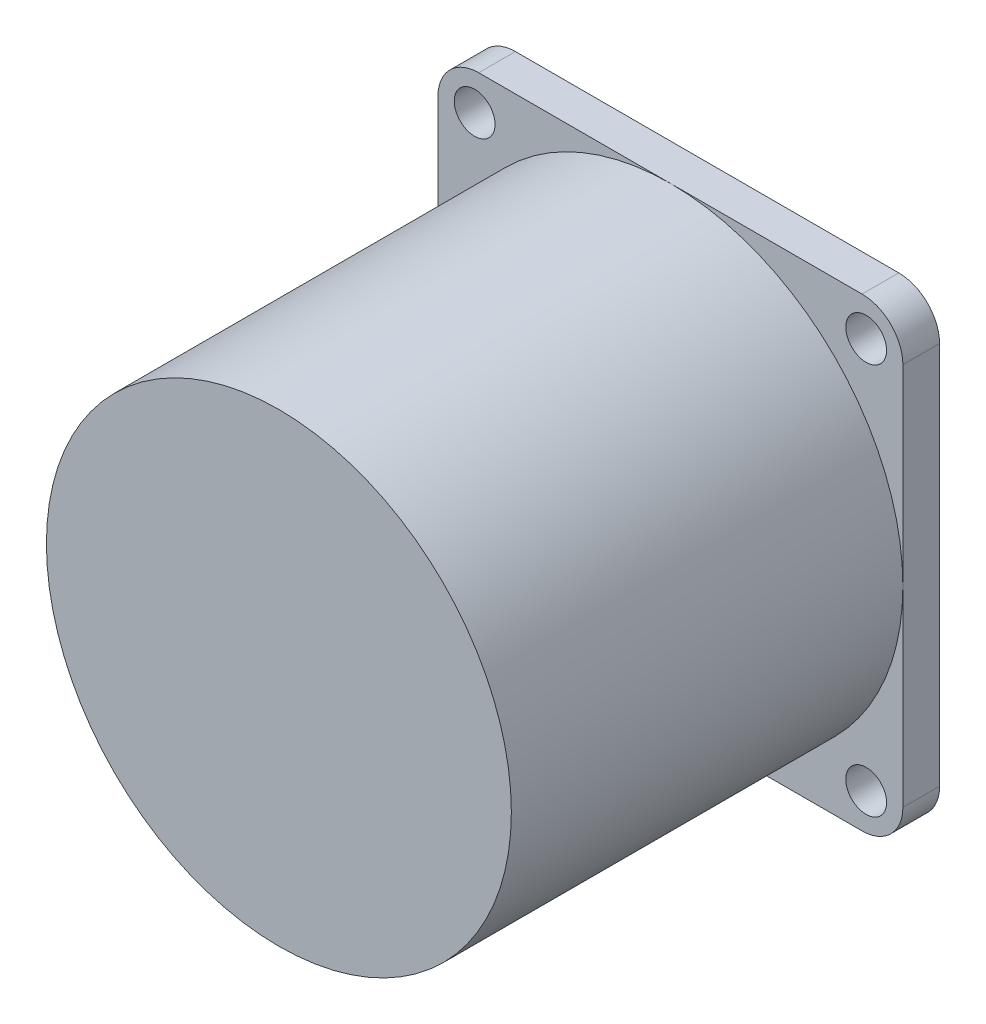
ISO-10303-21;
HEADER;
FILE_DESCRIPTION(('STEP AP214'),'2;1');
FILE_NAME('part.step','',(''),(''),'','','');
FILE_SCHEMA(('AUTOMOTIVE_DESIGN { 1 0 10303 214 1 1 1 1 }'));
ENDSEC;
DATA;
#1=APPLICATION_CONTEXT('core data for automotive mechanical design processes');
#2=APPLICATION_PROTOCOL_DEFINITION('international standard','automotive_design',2000,#1);
#3=PRODUCT_CONTEXT('',#1,'mechanical');
#4=PRODUCT('Part','Part','',(#3));
#5=PRODUCT_RELATED_PRODUCT_CATEGORY('part','',(#4));
#6=PRODUCT_DEFINITION_FORMATION('','',#4);
#7=PRODUCT_DEFINITION_CONTEXT('part definition',#1,'design');
#8=PRODUCT_DEFINITION('design','',#6,#7);
#9=PRODUCT_DEFINITION_SHAPE('','',#8);
#10=(LENGTH_UNIT() NAMED_UNIT(*) SI_UNIT(.MILLI.,.METRE.));
#11=(NAMED_UNIT(*) PLANE_ANGLE_UNIT() SI_UNIT($,.RADIAN.));
#12=(NAMED_UNIT(*) SI_UNIT($,.STERADIAN.) SOLID_ANGLE_UNIT());
#13=UNCERTAINTY_MEASURE_WITH_UNIT(LENGTH_MEASURE(1.E-05),#10,'distance_accuracy_value','');
#14=(GEOMETRIC_REPRESENTATION_CONTEXT(3) GLOBAL_UNCERTAINTY_ASSIGNED_CONTEXT((#13)) GLOBAL_UNIT_ASSIGNED_CONTEXT((#10,
#11,#12)) REPRESENTATION_CONTEXT('',''));
#15=CARTESIAN_POINT('',(0.,0.,0.));
#16=DIRECTION('',(0.,0.,1.));
#17=DIRECTION('',(1.,0.,0.));
#18=AXIS2_PLACEMENT_3D('',#15,#16,#17);
#19=CARTESIAN_POINT('',(-1.79855863382139,-6.79159049360147,-2.5));
#20=DIRECTION('',(0.,0.,-1.));
#21=DIRECTION('',(-1.,0.,0.));
#22=AXIS2_PLACEMENT_3D('',#19,#20,#21);
#23=PLANE('',#22);
#24=CARTESIAN_POINT('',(-1.79855863382139,-6.79159049360147,-2.5));
#25=DIRECTION('',(0.,0.,-1.));
#26=DIRECTION('',(-1.,0.,0.));
#27=AXIS2_PLACEMENT_3D('',#24,#25,#26);
#28=CIRCLE('',#27,6.75);
#29=CARTESIAN_POINT('',(-8.54855863382139,-6.79159049360147,-2.5));
#30=VERTEX_POINT('',#29);
#31=EDGE_CURVE('E144',#30,#30,#28,.T.);
#32=ORIENTED_EDGE('',*,*,#31,.T.);
#33=EDGE_LOOP('',(#32));
#34=FACE_BOUND('',#33,.T.);
#35=CARTESIAN_POINT('',(-1.79855863382139,-6.79159049360147,-2.5));
#36=DIRECTION('',(0.,0.,-1.));
#37=DIRECTION('',(-1.,0.,0.));
#38=AXIS2_PLACEMENT_3D('',#35,#36,#37);
#39=CIRCLE('',#38,3.);
#40=CARTESIAN_POINT('',(-4.79855863382139,-6.79159049360147,-2.5));
#41=VERTEX_POINT('',#40);
#42=EDGE_CURVE('E351',#41,#41,#39,.T.);
#43=ORIENTED_EDGE('',*,*,#42,.F.);
#44=EDGE_LOOP('',(#43));
#45=FACE_BOUND('',#44,.T.);
#46=ADVANCED_FACE('F34',(#34,#45),#23,.T.);
#47=CARTESIAN_POINT('',(-1.79855863382139,-6.79159049360147,-1.));
#48=DIRECTION('',(0.,0.,-1.));
#49=DIRECTION('',(-1.,0.,0.));
#50=AXIS2_PLACEMENT_3D('',#47,#48,#49);
#51=PLANE('',#50);
#52=CARTESIAN_POINT('',(-1.79855863382139,-6.79159049360147,-1.));
#53=DIRECTION('',(0.,0.,-1.));
#54=DIRECTION('',(-1.,0.,0.));
#55=AXIS2_PLACEMENT_3D('',#52,#53,#54);
#56=CIRCLE('',#55,18.);
#57=CARTESIAN_POINT('',(-19.7985586338214,-6.79159049360147,-1.));
#58=VERTEX_POINT('',#57);
#59=EDGE_CURVE('E38',#58,#58,#56,.T.);
#60=ORIENTED_EDGE('',*,*,#59,.T.);
#61=EDGE_LOOP('',(#60));
#62=FACE_BOUND('',#61,.T.);
#63=CARTESIAN_POINT('',(-1.79855863382139,-6.79159049360147,-1.));
#64=DIRECTION('',(0.,0.,-1.));
#65=DIRECTION('',(-1.,0.,0.));
#66=AXIS2_PLACEMENT_3D('',#63,#64,#65);
#67=CIRCLE('',#66,6.75);
#68=CARTESIAN_POINT('',(-8.54855863382139,-6.79159049360147,-1.));
#69=VERTEX_POINT('',#68);
#70=EDGE_CURVE('E350',#69,#69,#67,.T.);
#71=ORIENTED_EDGE('',*,*,#70,.F.);
#72=EDGE_LOOP('',(#71));
#73=FACE_BOUND('',#72,.T.);
#74=ADVANCED_FACE('F247',(#62,#73),#51,.T.);
#75=CARTESIAN_POINT('',(-30.2985586338214,-35.2915904936015,4.5));
#76=DIRECTION('',(0.,0.,1.));
#77=DIRECTION('',(1.,0.,0.));
#78=AXIS2_PLACEMENT_3D('',#75,#76,#77);
#79=PLANE('',#78);
#80=CARTESIAN_POINT('',(-1.79855863382139,-6.79159049360147,4.5));
#81=DIRECTION('',(0.,0.,1.));
#82=DIRECTION('',(1.,0.,0.));
#83=AXIS2_PLACEMENT_3D('',#80,#81,#82);
#84=CIRCLE('',#83,28.5);
#85=CARTESIAN_POINT('',(26.7014413661786,-6.79159049360147,4.5));
#86=VERTEX_POINT('',#85);
#87=CARTESIAN_POINT('',(-1.79855863382139,21.7084095063985,4.5));
#88=VERTEX_POINT('',#87);
#89=EDGE_CURVE('E45',#86,#88,#84,.T.);
#90=ORIENTED_EDGE('',*,*,#89,.F.);
#91=DIRECTION('',(0.,1.,0.));
#92=VECTOR('',#91,1.);
#93=CARTESIAN_POINT('',(26.7014413661786,21.7084095063985,4.5));
#94=LINE('',#93,#92);
#95=CARTESIAN_POINT('',(26.7014413661786,16.7084095063985,4.5));
#96=VERTEX_POINT('',#95);
#97=EDGE_CURVE('E125',#86,#96,#94,.T.);
#98=ORIENTED_EDGE('',*,*,#97,.T.);
#99=CARTESIAN_POINT('',(21.7014413661786,16.7084095063985,4.5));
#100=DIRECTION('',(0.,0.,1.));
#101=DIRECTION('',(1.,0.,0.));
#102=AXIS2_PLACEMENT_3D('',#99,#100,#101);
#103=CIRCLE('',#102,5.);
#104=CARTESIAN_POINT('',(21.7014413661786,21.7084095063985,4.5));
#105=VERTEX_POINT('',#104);
#106=EDGE_CURVE('E209',#96,#105,#103,.T.);
#107=ORIENTED_EDGE('',*,*,#106,.T.);
#108=DIRECTION('',(-1.,0.,0.));
#109=VECTOR('',#108,1.);
#110=CARTESIAN_POINT('',(-30.2985586338214,21.7084095063985,4.5));
#111=LINE('',#110,#109);
#112=EDGE_CURVE('E141',#105,#88,#111,.T.);
#113=ORIENTED_EDGE('',*,*,#112,.T.);
#114=EDGE_LOOP('',(#90,#98,#107,#113));
#115=FACE_BOUND('',#114,.T.);
#116=CARTESIAN_POINT('',(22.2014413661786,17.2084095063985,4.5));
#117=DIRECTION('',(0.,0.,1.));
#118=DIRECTION('',(1.,0.,0.));
#119=AXIS2_PLACEMENT_3D('',#116,#117,#118);
#120=CIRCLE('',#119,2.5);
#121=CARTESIAN_POINT('',(24.7014413661786,17.2084095063985,4.5));
#122=VERTEX_POINT('',#121);
#123=EDGE_CURVE('E164',#122,#122,#120,.T.);
#124=ORIENTED_EDGE('',*,*,#123,.F.);
#125=EDGE_LOOP('',(#124));
#126=FACE_BOUND('',#125,.T.);
#127=ADVANCED_FACE('F138',(#115,#126),#79,.T.);
#128=CARTESIAN_POINT('',(-30.2985586338214,-6.79159049360147,4.5));
#129=VERTEX_POINT('',#128);
#130=EDGE_CURVE('E11',#88,#129,#84,.T.);
#131=ORIENTED_EDGE('',*,*,#130,.F.);
#132=CARTESIAN_POINT('',(-25.2985586338214,21.7084095063985,4.5));
#133=VERTEX_POINT('',#132);
#134=EDGE_CURVE('E124',#88,#133,#111,.T.);
#135=ORIENTED_EDGE('',*,*,#134,.T.);
#136=CARTESIAN_POINT('',(-25.2985586338214,16.7084095063985,4.5));
#137=DIRECTION('',(0.,0.,1.));
#138=DIRECTION('',(1.,0.,0.));
#139=AXIS2_PLACEMENT_3D('',#136,#137,#138);
#140=CIRCLE('',#139,5.);
#141=CARTESIAN_POINT('',(-30.2985586338214,16.7084095063985,4.5));
#142=VERTEX_POINT('',#141);
#143=EDGE_CURVE('E213',#133,#142,#140,.T.);
#144=ORIENTED_EDGE('',*,*,#143,.T.);
#145=DIRECTION('',(0.,-1.,0.));
#146=VECTOR('',#145,1.);
#147=CARTESIAN_POINT('',(-30.2985586338214,21.7084095063985,4.5));
#148=LINE('',#147,#146);
#149=EDGE_CURVE('E176',#142,#129,#148,.T.);
#150=ORIENTED_EDGE('',*,*,#149,.T.);
#151=EDGE_LOOP('',(#131,#135,#144,#150));
#152=FACE_BOUND('',#151,.T.);
#153=CARTESIAN_POINT('',(-25.7985586338214,17.2084095063985,4.5));
#154=DIRECTION('',(0.,0.,1.));
#155=DIRECTION('',(1.,0.,0.));
#156=AXIS2_PLACEMENT_3D('',#153,#154,#155);
#157=CIRCLE('',#156,2.5);
#158=CARTESIAN_POINT('',(-23.2985586338214,17.2084095063985,4.5));
#159=VERTEX_POINT('',#158);
#160=EDGE_CURVE('E170',#159,#159,#157,.T.);
#161=ORIENTED_EDGE('',*,*,#160,.F.);
#162=EDGE_LOOP('',(#161));
#163=FACE_BOUND('',#162,.T.);
#164=ADVANCED_FACE('F243',(#152,#163),#79,.T.);
#165=CARTESIAN_POINT('',(-1.79855863382139,-35.2915904936015,4.5));
#166=VERTEX_POINT('',#165);
#167=EDGE_CURVE('E43',#129,#166,#84,.T.);
#168=ORIENTED_EDGE('',*,*,#167,.F.);
#169=CARTESIAN_POINT('',(-30.2985586338214,-30.2915904936015,4.5));
#170=VERTEX_POINT('',#169);
#171=EDGE_CURVE('E179',#129,#170,#148,.T.);
#172=ORIENTED_EDGE('',*,*,#171,.T.);
#173=CARTESIAN_POINT('',(-25.2985586338214,-30.2915904936015,4.5));
#174=DIRECTION('',(0.,0.,1.));
#175=DIRECTION('',(1.,0.,0.));
#176=AXIS2_PLACEMENT_3D('',#173,#174,#175);
#177=CIRCLE('',#176,5.);
#178=CARTESIAN_POINT('',(-25.2985586338214,-35.2915904936015,4.5));
#179=VERTEX_POINT('',#178);
#180=EDGE_CURVE('E211',#170,#179,#177,.T.);
#181=ORIENTED_EDGE('',*,*,#180,.T.);
#182=DIRECTION('',(1.,0.,0.));
#183=VECTOR('',#182,1.);
#184=CARTESIAN_POINT('',(-30.2985586338214,-35.2915904936015,4.5));
#185=LINE('',#184,#183);
#186=EDGE_CURVE('E135',#179,#166,#185,.T.);
#187=ORIENTED_EDGE('',*,*,#186,.T.);
#188=EDGE_LOOP('',(#168,#172,#181,#187));
#189=FACE_BOUND('',#188,.T.);
#190=CARTESIAN_POINT('',(-25.7985586338214,-30.7915904936015,4.5));
#191=DIRECTION('',(0.,0.,1.));
#192=DIRECTION('',(1.,0.,0.));
#193=AXIS2_PLACEMENT_3D('',#190,#191,#192);
#194=CIRCLE('',#193,2.5);
#195=CARTESIAN_POINT('',(-23.2985586338214,-30.7915904936015,4.5));
#196=VERTEX_POINT('',#195);
#197=EDGE_CURVE('E151',#196,#196,#194,.T.);
#198=ORIENTED_EDGE('',*,*,#197,.F.);
#199=EDGE_LOOP('',(#198));
#200=FACE_BOUND('',#199,.T.);
#201=ADVANCED_FACE('F234',(#189,#200),#79,.T.);
#202=CARTESIAN_POINT('',(-30.2985586338214,-35.2915904936015,0.));
#203=DIRECTION('',(0.,0.,1.));
#204=DIRECTION('',(1.,0.,0.));
#205=AXIS2_PLACEMENT_3D('',#202,#203,#204);
#206=PLANE('',#205);
#207=CARTESIAN_POINT('',(-25.7985586338214,-30.7915904936015,0.));
#208=DIRECTION('',(0.,0.,1.));
#209=DIRECTION('',(1.,0.,0.));
#210=AXIS2_PLACEMENT_3D('',#207,#208,#209);
#211=CIRCLE('',#210,2.5);
#212=CARTESIAN_POINT('',(-23.2985586338214,-30.7915904936015,0.));
#213=VERTEX_POINT('',#212);
#214=EDGE_CURVE('E155',#213,#213,#211,.T.);
#215=ORIENTED_EDGE('',*,*,#214,.T.);
#216=EDGE_LOOP('',(#215));
#217=FACE_BOUND('',#216,.T.);
#218=CARTESIAN_POINT('',(22.2014413661786,17.2084095063985,0.));
#219=DIRECTION('',(0.,0.,1.));
#220=DIRECTION('',(1.,0.,0.));
#221=AXIS2_PLACEMENT_3D('',#218,#219,#220);
#222=CIRCLE('',#221,2.5);
#223=CARTESIAN_POINT('',(24.7014413661786,17.2084095063985,0.));
#224=VERTEX_POINT('',#223);
#225=EDGE_CURVE('E161',#224,#224,#222,.T.);
#226=ORIENTED_EDGE('',*,*,#225,.T.);
#227=EDGE_LOOP('',(#226));
#228=FACE_BOUND('',#227,.T.);
#229=DIRECTION('',(0.,1.,0.));
#230=VECTOR('',#229,1.);
#231=CARTESIAN_POINT('',(26.7014413661786,21.7084095063985,0.));
#232=LINE('',#231,#230);
#233=CARTESIAN_POINT('',(26.7014413661786,-30.2915904936015,0.));
#234=VERTEX_POINT('',#233);
#235=CARTESIAN_POINT('',(26.7014413661786,16.7084095063985,0.));
#236=VERTEX_POINT('',#235);
#237=EDGE_CURVE('E187',#234,#236,#232,.T.);
#238=ORIENTED_EDGE('',*,*,#237,.F.);
#239=CARTESIAN_POINT('',(21.7014413661786,-30.2915904936015,0.));
#240=DIRECTION('',(0.,0.,1.));
#241=DIRECTION('',(1.,0.,0.));
#242=AXIS2_PLACEMENT_3D('',#239,#240,#241);
#243=CIRCLE('',#242,5.);
#244=CARTESIAN_POINT('',(21.7014413661786,-35.2915904936015,0.));
#245=VERTEX_POINT('',#244);
#246=EDGE_CURVE('E201',#234,#245,#243,.F.);
#247=ORIENTED_EDGE('',*,*,#246,.T.);
#248=DIRECTION('',(1.,0.,0.));
#249=VECTOR('',#248,1.);
#250=CARTESIAN_POINT('',(-30.2985586338214,-35.2915904936015,0.));
#251=LINE('',#250,#249);
#252=CARTESIAN_POINT('',(-25.2985586338214,-35.2915904936015,0.));
#253=VERTEX_POINT('',#252);
#254=EDGE_CURVE('E184',#253,#245,#251,.T.);
#255=ORIENTED_EDGE('',*,*,#254,.F.);
#256=CARTESIAN_POINT('',(-25.2985586338214,-30.2915904936015,0.));
#257=DIRECTION('',(0.,0.,1.));
#258=DIRECTION('',(1.,0.,0.));
#259=AXIS2_PLACEMENT_3D('',#256,#257,#258);
#260=CIRCLE('',#259,5.);
#261=CARTESIAN_POINT('',(-30.2985586338214,-30.2915904936015,0.));
#262=VERTEX_POINT('',#261);
#263=EDGE_CURVE('E197',#253,#262,#260,.F.);
#264=ORIENTED_EDGE('',*,*,#263,.T.);
#265=DIRECTION('',(0.,-1.,0.));
#266=VECTOR('',#265,1.);
#267=CARTESIAN_POINT('',(-30.2985586338214,21.7084095063985,0.));
#268=LINE('',#267,#266);
#269=CARTESIAN_POINT('',(-30.2985586338214,16.7084095063985,0.));
#270=VERTEX_POINT('',#269);
#271=EDGE_CURVE('E173',#270,#262,#268,.T.);
#272=ORIENTED_EDGE('',*,*,#271,.F.);
#273=CARTESIAN_POINT('',(-25.2985586338214,16.7084095063985,0.));
#274=DIRECTION('',(0.,0.,1.));
#275=DIRECTION('',(1.,0.,0.));
#276=AXIS2_PLACEMENT_3D('',#273,#274,#275);
#277=CIRCLE('',#276,5.);
#278=CARTESIAN_POINT('',(-25.2985586338214,21.7084095063985,0.));
#279=VERTEX_POINT('',#278);
#280=EDGE_CURVE('E199',#270,#279,#277,.F.);
#281=ORIENTED_EDGE('',*,*,#280,.T.);
#282=DIRECTION('',(-1.,0.,0.));
#283=VECTOR('',#282,1.);
#284=CARTESIAN_POINT('',(-30.2985586338214,21.7084095063985,0.));
#285=LINE('',#284,#283);
#286=CARTESIAN_POINT('',(21.7014413661786,21.7084095063985,0.));
#287=VERTEX_POINT('',#286);
#288=EDGE_CURVE('E189',#287,#279,#285,.T.);
#289=ORIENTED_EDGE('',*,*,#288,.F.);
#290=CARTESIAN_POINT('',(21.7014413661786,16.7084095063985,0.));
#291=DIRECTION('',(0.,0.,1.));
#292=DIRECTION('',(1.,0.,0.));
#293=AXIS2_PLACEMENT_3D('',#290,#291,#292);
#294=CIRCLE('',#293,5.);
#295=EDGE_CURVE('E195',#287,#236,#294,.F.);
#296=ORIENTED_EDGE('',*,*,#295,.T.);
#297=EDGE_LOOP('',(#238,#247,#255,#264,#272,#281,#289,#296));
#298=FACE_BOUND('',#297,.T.);
#299=CARTESIAN_POINT('',(-25.7985586338214,17.2084095063985,0.));
#300=DIRECTION('',(0.,0.,1.));
#301=DIRECTION('',(1.,0.,0.));
#302=AXIS2_PLACEMENT_3D('',#299,#300,#301);
#303=CIRCLE('',#302,2.5);
#304=CARTESIAN_POINT('',(-23.2985586338214,17.2084095063985,0.));
#305=VERTEX_POINT('',#304);
#306=EDGE_CURVE('E167',#305,#305,#303,.T.);
#307=ORIENTED_EDGE('',*,*,#306,.T.);
#308=EDGE_LOOP('',(#307));
#309=FACE_BOUND('',#308,.T.);
#310=CARTESIAN_POINT('',(22.2014413661786,-30.7915904936015,0.));
#311=DIRECTION('',(0.,0.,1.));
#312=DIRECTION('',(1.,0.,0.));
#313=AXIS2_PLACEMENT_3D('',#310,#311,#312);
#314=CIRCLE('',#313,2.5);
#315=CARTESIAN_POINT('',(24.7014413661786,-30.7915904936015,0.));
#316=VERTEX_POINT('',#315);
#317=EDGE_CURVE('E154',#316,#316,#314,.T.);
#318=ORIENTED_EDGE('',*,*,#317,.T.);
#319=EDGE_LOOP('',(#318));
#320=FACE_BOUND('',#319,.T.);
#321=CARTESIAN_POINT('',(-1.79855863382139,-6.79159049360147,0.));
#322=DIRECTION('',(0.,0.,1.));
#323=DIRECTION('',(1.,0.,0.));
#324=AXIS2_PLACEMENT_3D('',#321,#322,#323);
#325=CIRCLE('',#324,19.);
#326=CARTESIAN_POINT('',(17.2014413661786,-6.79159049360147,0.));
#327=VERTEX_POINT('',#326);
#328=EDGE_CURVE('E147',#327,#327,#325,.F.);
#329=ORIENTED_EDGE('',*,*,#328,.F.);
#330=EDGE_LOOP('',(#329));
#331=FACE_BOUND('',#330,.T.);
#332=ADVANCED_FACE('F232',(#217,#228,#298,#309,#320,#331),#206,.F.);
#333=EDGE_CURVE('E117',#166,#86,#84,.T.);
#334=ORIENTED_EDGE('',*,*,#333,.F.);
#335=CARTESIAN_POINT('',(21.7014413661786,-35.2915904936015,4.5));
#336=VERTEX_POINT('',#335);
#337=EDGE_CURVE('E178',#166,#336,#185,.T.);
#338=ORIENTED_EDGE('',*,*,#337,.T.);
#339=CARTESIAN_POINT('',(21.7014413661786,-30.2915904936015,4.5));
#340=DIRECTION('',(0.,0.,1.));
#341=DIRECTION('',(1.,0.,0.));
#342=AXIS2_PLACEMENT_3D('',#339,#340,#341);
#343=CIRCLE('',#342,5.);
#344=CARTESIAN_POINT('',(26.7014413661786,-30.2915904936015,4.5));
#345=VERTEX_POINT('',#344);
#346=EDGE_CURVE('E120',#336,#345,#343,.T.);
#347=ORIENTED_EDGE('',*,*,#346,.T.);
#348=EDGE_CURVE('E112',#345,#86,#94,.T.);
#349=ORIENTED_EDGE('',*,*,#348,.T.);
#350=EDGE_LOOP('',(#334,#338,#347,#349));
#351=FACE_BOUND('',#350,.T.);
#352=CARTESIAN_POINT('',(22.2014413661786,-30.7915904936015,4.5));
#353=DIRECTION('',(0.,0.,1.));
#354=DIRECTION('',(1.,0.,0.));
#355=AXIS2_PLACEMENT_3D('',#352,#353,#354);
#356=CIRCLE('',#355,2.5);
#357=CARTESIAN_POINT('',(24.7014413661786,-30.7915904936015,4.5));
#358=VERTEX_POINT('',#357);
#359=EDGE_CURVE('E158',#358,#358,#356,.T.);
#360=ORIENTED_EDGE('',*,*,#359,.F.);
#361=EDGE_LOOP('',(#360));
#362=FACE_BOUND('',#361,.T.);
#363=ADVANCED_FACE('F114',(#351,#362),#79,.T.);
#364=CARTESIAN_POINT('',(-30.2985586338214,21.7084095063985,4.5));
#365=DIRECTION('',(1.,0.,0.));
#366=DIRECTION('',(0.,0.,-1.));
#367=AXIS2_PLACEMENT_3D('',#364,#365,#366);
#368=PLANE('',#367);
#369=ORIENTED_EDGE('',*,*,#149,.F.);
#370=DIRECTION('',(0.,0.,-1.));
#371=VECTOR('',#370,1.);
#372=CARTESIAN_POINT('',(-30.2985586338214,16.7084095063985,4.5));
#373=LINE('',#372,#371);
#374=EDGE_CURVE('E219',#142,#270,#373,.T.);
#375=ORIENTED_EDGE('',*,*,#374,.T.);
#376=ORIENTED_EDGE('',*,*,#271,.T.);
#377=DIRECTION('',(0.,0.,-1.));
#378=VECTOR('',#377,1.);
#379=CARTESIAN_POINT('',(-30.2985586338214,-30.2915904936015,4.5));
#380=LINE('',#379,#378);
#381=EDGE_CURVE('E216',#262,#170,#380,.F.);
#382=ORIENTED_EDGE('',*,*,#381,.T.);
#383=ORIENTED_EDGE('',*,*,#171,.F.);
#384=EDGE_LOOP('',(#369,#375,#376,#382,#383));
#385=FACE_BOUND('',#384,.T.);
#386=ADVANCED_FACE('F241',(#385),#368,.F.);
#387=CARTESIAN_POINT('',(-30.2985586338214,-35.2915904936015,4.5));
#388=DIRECTION('',(0.,1.,0.));
#389=DIRECTION('',(0.,0.,1.));
#390=AXIS2_PLACEMENT_3D('',#387,#388,#389);
#391=PLANE('',#390);
#392=ORIENTED_EDGE('',*,*,#254,.T.);
#393=DIRECTION('',(0.,0.,-1.));
#394=VECTOR('',#393,1.);
#395=CARTESIAN_POINT('',(21.7014413661786,-35.2915904936015,4.5));
#396=LINE('',#395,#394);
#397=EDGE_CURVE('E206',#245,#336,#396,.F.);
#398=ORIENTED_EDGE('',*,*,#397,.T.);
#399=ORIENTED_EDGE('',*,*,#337,.F.);
#400=ORIENTED_EDGE('',*,*,#186,.F.);
#401=DIRECTION('',(0.,0.,-1.));
#402=VECTOR('',#401,1.);
#403=CARTESIAN_POINT('',(-25.2985586338214,-35.2915904936015,4.5));
#404=LINE('',#403,#402);
#405=EDGE_CURVE('E203',#179,#253,#404,.T.);
#406=ORIENTED_EDGE('',*,*,#405,.T.);
#407=EDGE_LOOP('',(#392,#398,#399,#400,#406));
#408=FACE_BOUND('',#407,.T.);
#409=ADVANCED_FACE('F430',(#408),#391,.F.);
#410=CARTESIAN_POINT('',(26.7014413661786,21.7084095063985,4.5));
#411=DIRECTION('',(-1.,0.,0.));
#412=DIRECTION('',(0.,-1.,0.));
#413=AXIS2_PLACEMENT_3D('',#410,#411,#412);
#414=PLANE('',#413);
#415=ORIENTED_EDGE('',*,*,#348,.F.);
#416=DIRECTION('',(0.,0.,-1.));
#417=VECTOR('',#416,1.);
#418=CARTESIAN_POINT('',(26.7014413661786,-30.2915904936015,4.5));
#419=LINE('',#418,#417);
#420=EDGE_CURVE('E193',#345,#234,#419,.T.);
#421=ORIENTED_EDGE('',*,*,#420,.T.);
#422=ORIENTED_EDGE('',*,*,#237,.T.);
#423=DIRECTION('',(0.,0.,-1.));
#424=VECTOR('',#423,1.);
#425=CARTESIAN_POINT('',(26.7014413661786,16.7084095063985,4.5));
#426=LINE('',#425,#424);
#427=EDGE_CURVE('E132',#236,#96,#426,.F.);
#428=ORIENTED_EDGE('',*,*,#427,.T.);
#429=ORIENTED_EDGE('',*,*,#97,.F.);
#430=EDGE_LOOP('',(#415,#421,#422,#428,#429));
#431=FACE_BOUND('',#430,.T.);
#432=ADVANCED_FACE('F129',(#431),#414,.F.);
#433=CARTESIAN_POINT('',(-30.2985586338214,21.7084095063985,4.5));
#434=DIRECTION('',(0.,-1.,0.));
#435=DIRECTION('',(0.,0.,-1.));
#436=AXIS2_PLACEMENT_3D('',#433,#434,#435);
#437=PLANE('',#436);
#438=ORIENTED_EDGE('',*,*,#288,.T.);
#439=DIRECTION('',(0.,0.,-1.));
#440=VECTOR('',#439,1.);
#441=CARTESIAN_POINT('',(-25.2985586338214,21.7084095063985,4.5));
#442=LINE('',#441,#440);
#443=EDGE_CURVE('E225',#279,#133,#442,.F.);
#444=ORIENTED_EDGE('',*,*,#443,.T.);
#445=ORIENTED_EDGE('',*,*,#134,.F.);
#446=ORIENTED_EDGE('',*,*,#112,.F.);
#447=DIRECTION('',(0.,0.,-1.));
#448=VECTOR('',#447,1.);
#449=CARTESIAN_POINT('',(21.7014413661786,21.7084095063985,4.5));
#450=LINE('',#449,#448);
#451=EDGE_CURVE('E222',#105,#287,#450,.T.);
#452=ORIENTED_EDGE('',*,*,#451,.T.);
#453=EDGE_LOOP('',(#438,#444,#445,#446,#452));
#454=FACE_BOUND('',#453,.T.);
#455=ADVANCED_FACE('F287',(#454),#437,.F.);
#456=CARTESIAN_POINT('',(-25.7985586338214,17.2084095063985,4.5));
#457=DIRECTION('',(0.,0.,-1.));
#458=DIRECTION('',(-1.,0.,0.));
#459=AXIS2_PLACEMENT_3D('',#456,#457,#458);
#460=CYLINDRICAL_SURFACE('',#459,2.5);
#461=ORIENTED_EDGE('',*,*,#160,.T.);
#462=EDGE_LOOP('',(#461));
#463=FACE_BOUND('',#462,.T.);
#464=ORIENTED_EDGE('',*,*,#306,.F.);
#465=EDGE_LOOP('',(#464));
#466=FACE_BOUND('',#465,.T.);
#467=ADVANCED_FACE('F284',(#463,#466),#460,.F.);
#468=CARTESIAN_POINT('',(22.2014413661786,17.2084095063985,4.5));
#469=DIRECTION('',(0.,0.,-1.));
#470=DIRECTION('',(-1.,0.,0.));
#471=AXIS2_PLACEMENT_3D('',#468,#469,#470);
#472=CYLINDRICAL_SURFACE('',#471,2.5);
#473=ORIENTED_EDGE('',*,*,#123,.T.);
#474=EDGE_LOOP('',(#473));
#475=FACE_BOUND('',#474,.T.);
#476=ORIENTED_EDGE('',*,*,#225,.F.);
#477=EDGE_LOOP('',(#476));
#478=FACE_BOUND('',#477,.T.);
#479=ADVANCED_FACE('F280',(#475,#478),#472,.F.);
#480=CARTESIAN_POINT('',(22.2014413661786,-30.7915904936015,4.5));
#481=DIRECTION('',(0.,0.,-1.));
#482=DIRECTION('',(-1.,0.,0.));
#483=AXIS2_PLACEMENT_3D('',#480,#481,#482);
#484=CYLINDRICAL_SURFACE('',#483,2.5);
#485=ORIENTED_EDGE('',*,*,#359,.T.);
#486=EDGE_LOOP('',(#485));
#487=FACE_BOUND('',#486,.T.);
#488=ORIENTED_EDGE('',*,*,#317,.F.);
#489=EDGE_LOOP('',(#488));
#490=FACE_BOUND('',#489,.T.);
#491=ADVANCED_FACE('F276',(#487,#490),#484,.F.);
#492=CARTESIAN_POINT('',(-25.7985586338214,-30.7915904936015,4.5));
#493=DIRECTION('',(0.,0.,-1.));
#494=DIRECTION('',(-1.,0.,0.));
#495=AXIS2_PLACEMENT_3D('',#492,#493,#494);
#496=CYLINDRICAL_SURFACE('',#495,2.5);
#497=ORIENTED_EDGE('',*,*,#197,.T.);
#498=EDGE_LOOP('',(#497));
#499=FACE_BOUND('',#498,.T.);
#500=ORIENTED_EDGE('',*,*,#214,.F.);
#501=EDGE_LOOP('',(#500));
#502=FACE_BOUND('',#501,.T.);
#503=ADVANCED_FACE('F272',(#499,#502),#496,.F.);
#504=CARTESIAN_POINT('',(21.7014413661786,-30.2915904936015,4.5));
#505=DIRECTION('',(0.,0.,-1.));
#506=DIRECTION('',(-1.,0.,0.));
#507=AXIS2_PLACEMENT_3D('',#504,#505,#506);
#508=CYLINDRICAL_SURFACE('',#507,5.);
#509=ORIENTED_EDGE('',*,*,#346,.F.);
#510=ORIENTED_EDGE('',*,*,#397,.F.);
#511=ORIENTED_EDGE('',*,*,#246,.F.);
#512=ORIENTED_EDGE('',*,*,#420,.F.);
#513=EDGE_LOOP('',(#509,#510,#511,#512));
#514=FACE_BOUND('',#513,.T.);
#515=ADVANCED_FACE('F275',(#514),#508,.T.);
#516=CARTESIAN_POINT('',(-25.2985586338214,16.7084095063985,4.5));
#517=DIRECTION('',(0.,0.,-1.));
#518=DIRECTION('',(-1.,0.,0.));
#519=AXIS2_PLACEMENT_3D('',#516,#517,#518);
#520=CYLINDRICAL_SURFACE('',#519,5.);
#521=ORIENTED_EDGE('',*,*,#143,.F.);
#522=ORIENTED_EDGE('',*,*,#443,.F.);
#523=ORIENTED_EDGE('',*,*,#280,.F.);
#524=ORIENTED_EDGE('',*,*,#374,.F.);
#525=EDGE_LOOP('',(#521,#522,#523,#524));
#526=FACE_BOUND('',#525,.T.);
#527=ADVANCED_FACE('F383',(#526),#520,.T.);
#528=CARTESIAN_POINT('',(-25.2985586338214,-30.2915904936015,4.5));
#529=DIRECTION('',(0.,0.,-1.));
#530=DIRECTION('',(-1.,0.,0.));
#531=AXIS2_PLACEMENT_3D('',#528,#529,#530);
#532=CYLINDRICAL_SURFACE('',#531,5.);
#533=ORIENTED_EDGE('',*,*,#180,.F.);
#534=ORIENTED_EDGE('',*,*,#381,.F.);
#535=ORIENTED_EDGE('',*,*,#263,.F.);
#536=ORIENTED_EDGE('',*,*,#405,.F.);
#537=EDGE_LOOP('',(#533,#534,#535,#536));
#538=FACE_BOUND('',#537,.T.);
#539=ADVANCED_FACE('F376',(#538),#532,.T.);
#540=CARTESIAN_POINT('',(21.7014413661786,16.7084095063985,4.5));
#541=DIRECTION('',(0.,0.,-1.));
#542=DIRECTION('',(-1.,0.,0.));
#543=AXIS2_PLACEMENT_3D('',#540,#541,#542);
#544=CYLINDRICAL_SURFACE('',#543,5.);
#545=ORIENTED_EDGE('',*,*,#106,.F.);
#546=ORIENTED_EDGE('',*,*,#427,.F.);
#547=ORIENTED_EDGE('',*,*,#295,.F.);
#548=ORIENTED_EDGE('',*,*,#451,.F.);
#549=EDGE_LOOP('',(#545,#546,#547,#548));
#550=FACE_BOUND('',#549,.T.);
#551=ADVANCED_FACE('F370',(#550),#544,.T.);
#552=CARTESIAN_POINT('',(-1.79855863382139,-6.79159049360147,-1.));
#553=DIRECTION('',(0.,0.,1.));
#554=DIRECTION('',(1.,0.,0.));
#555=AXIS2_PLACEMENT_3D('',#552,#553,#554);
#556=CONICAL_SURFACE('',#555,18.,0.785398163397445);
#557=ORIENTED_EDGE('',*,*,#328,.T.);
#558=EDGE_LOOP('',(#557));
#559=FACE_BOUND('',#558,.T.);
#560=ORIENTED_EDGE('',*,*,#59,.F.);
#561=EDGE_LOOP('',(#560));
#562=FACE_BOUND('',#561,.T.);
#563=ADVANCED_FACE('F36',(#559,#562),#556,.T.);
#564=CARTESIAN_POINT('',(-1.79855863382139,-6.79159049360147,52.5));
#565=DIRECTION('',(0.,0.,-1.));
#566=DIRECTION('',(-1.,0.,0.));
#567=AXIS2_PLACEMENT_3D('',#564,#565,#566);
#568=CYLINDRICAL_SURFACE('',#567,28.5);
#569=CARTESIAN_POINT('',(-1.79855863382139,-6.79159049360147,52.5));
#570=DIRECTION('',(0.,0.,1.));
#571=DIRECTION('',(1.,0.,0.));
#572=AXIS2_PLACEMENT_3D('',#569,#570,#571);
#573=CIRCLE('',#572,28.5);
#574=CARTESIAN_POINT('',(26.7014413661786,-6.79159049360147,52.5));
#575=VERTEX_POINT('',#574);
#576=EDGE_CURVE('E143',#575,#575,#573,.T.);
#577=ORIENTED_EDGE('',*,*,#576,.F.);
#578=EDGE_LOOP('',(#577));
#579=FACE_BOUND('',#578,.T.);
#580=ORIENTED_EDGE('',*,*,#89,.T.);
#581=ORIENTED_EDGE('',*,*,#130,.T.);
#582=ORIENTED_EDGE('',*,*,#167,.T.);
#583=ORIENTED_EDGE('',*,*,#333,.T.);
#584=EDGE_LOOP('',(#580,#581,#582,#583));
#585=FACE_BOUND('',#584,.T.);
#586=ADVANCED_FACE('F145',(#579,#585),#568,.T.);
#587=CARTESIAN_POINT('',(-1.79855863382139,-6.79159049360147,52.5));
#588=DIRECTION('',(0.,0.,1.));
#589=DIRECTION('',(1.,0.,0.));
#590=AXIS2_PLACEMENT_3D('',#587,#588,#589);
#591=PLANE('',#590);
#592=ORIENTED_EDGE('',*,*,#576,.T.);
#593=EDGE_LOOP('',(#592));
#594=FACE_BOUND('',#593,.T.);
#595=ADVANCED_FACE('F264',(#594),#591,.T.);
#596=CARTESIAN_POINT('',(-1.79855863382139,-6.79159049360147,-2.5));
#597=DIRECTION('',(0.,0.,1.));
#598=DIRECTION('',(1.,0.,0.));
#599=AXIS2_PLACEMENT_3D('',#596,#597,#598);
#600=CYLINDRICAL_SURFACE('',#599,6.75);
#601=ORIENTED_EDGE('',*,*,#31,.F.);
#602=EDGE_LOOP('',(#601));
#603=FACE_BOUND('',#602,.T.);
#604=ORIENTED_EDGE('',*,*,#70,.T.);
#605=EDGE_LOOP('',(#604));
#606=FACE_BOUND('',#605,.T.);
#607=ADVANCED_FACE('F261',(#603,#606),#600,.T.);
#608=CARTESIAN_POINT('',(-1.79855863382139,-6.79159049360147,-22.5));
#609=DIRECTION('',(0.,0.,1.));
#610=DIRECTION('',(1.,0.,0.));
#611=AXIS2_PLACEMENT_3D('',#608,#609,#610);
#612=CYLINDRICAL_SURFACE('',#611,3.);
#613=CARTESIAN_POINT('',(-1.79855863382139,-6.79159049360147,-22.5));
#614=DIRECTION('',(0.,0.,-1.));
#615=DIRECTION('',(-1.,0.,0.));
#616=AXIS2_PLACEMENT_3D('',#613,#614,#615);
#617=CIRCLE('',#616,3.);
#618=CARTESIAN_POINT('',(-4.79855863382139,-6.79159049360147,-22.5));
#619=VERTEX_POINT('',#618);
#620=EDGE_CURVE('E349',#619,#619,#617,.T.);
#621=ORIENTED_EDGE('',*,*,#620,.F.);
#622=EDGE_LOOP('',(#621));
#623=FACE_BOUND('',#622,.T.);
#624=ORIENTED_EDGE('',*,*,#42,.T.);
#625=EDGE_LOOP('',(#624));
#626=FACE_BOUND('',#625,.T.);
#627=ADVANCED_FACE('F259',(#623,#626),#612,.T.);
#628=CARTESIAN_POINT('',(-1.79855863382139,-6.79159049360147,-22.5));
#629=DIRECTION('',(0.,0.,-1.));
#630=DIRECTION('',(-1.,0.,0.));
#631=AXIS2_PLACEMENT_3D('',#628,#629,#630);
#632=PLANE('',#631);
#633=ORIENTED_EDGE('',*,*,#620,.T.);
#634=EDGE_LOOP('',(#633));
#635=FACE_BOUND('',#634,.T.);
#636=ADVANCED_FACE('F335',(#635),#632,.T.);
#637=CLOSED_SHELL('',(#46,#74,#127,#164,#201,#332,#363,#386,#409,#432,#455,#467,#479,#491,#503,
#515,#527,#539,#551,#563,#586,#595,#607,#627,#636));
#638=MANIFOLD_SOLID_BREP('B2',#637);
#639=ADVANCED_BREP_SHAPE_REPRESENTATION('',(#18,#638),#14);
#640=SHAPE_DEFINITION_REPRESENTATION(#9,#639);
ENDSEC;
END-ISO-10303-21;
